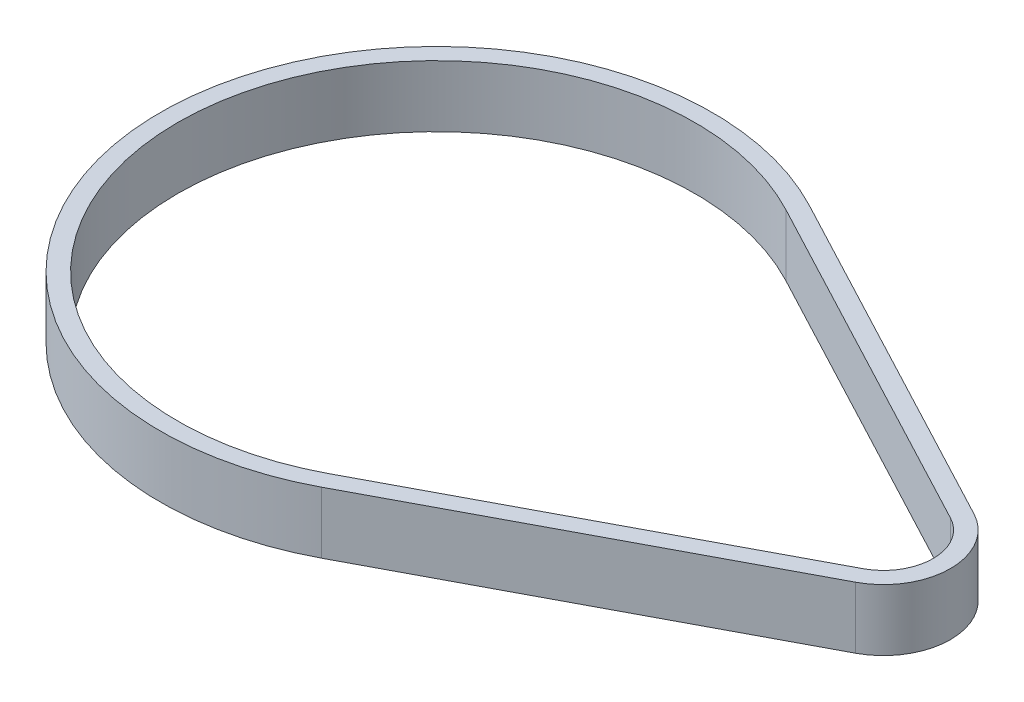
ISO-10303-21;
HEADER;
FILE_DESCRIPTION(('STEP AP214'),'2;1');
FILE_NAME('part.step','',(''),(''),'','','');
FILE_SCHEMA(('AUTOMOTIVE_DESIGN { 1 0 10303 214 1 1 1 1 }'));
ENDSEC;
DATA;
#1=APPLICATION_CONTEXT('core data for automotive mechanical design processes');
#2=APPLICATION_PROTOCOL_DEFINITION('international standard','automotive_design',2000,#1);
#3=PRODUCT_CONTEXT('',#1,'mechanical');
#4=PRODUCT('Part','Part','',(#3));
#5=PRODUCT_RELATED_PRODUCT_CATEGORY('part','',(#4));
#6=PRODUCT_DEFINITION_FORMATION('','',#4);
#7=PRODUCT_DEFINITION_CONTEXT('part definition',#1,'design');
#8=PRODUCT_DEFINITION('design','',#6,#7);
#9=PRODUCT_DEFINITION_SHAPE('','',#8);
#10=(LENGTH_UNIT() NAMED_UNIT(*) SI_UNIT(.MILLI.,.METRE.));
#11=(NAMED_UNIT(*) PLANE_ANGLE_UNIT() SI_UNIT($,.RADIAN.));
#12=(NAMED_UNIT(*) SI_UNIT($,.STERADIAN.) SOLID_ANGLE_UNIT());
#13=UNCERTAINTY_MEASURE_WITH_UNIT(LENGTH_MEASURE(1.E-05),#10,'distance_accuracy_value','');
#14=(GEOMETRIC_REPRESENTATION_CONTEXT(3) GLOBAL_UNCERTAINTY_ASSIGNED_CONTEXT((#13)) GLOBAL_UNIT_ASSIGNED_CONTEXT((#10,
#11,#12)) REPRESENTATION_CONTEXT('',''));
#15=CARTESIAN_POINT('',(0.,0.,0.));
#16=DIRECTION('',(0.,0.,1.));
#17=DIRECTION('',(1.,0.,0.));
#18=AXIS2_PLACEMENT_3D('',#15,#16,#17);
#19=CARTESIAN_POINT('',(0.,9.,0.));
#20=DIRECTION('',(0.,1.,0.));
#21=DIRECTION('',(0.,0.,1.));
#22=AXIS2_PLACEMENT_3D('',#19,#20,#21);
#23=PLANE('',#22);
#24=CARTESIAN_POINT('',(0.,9.,0.));
#25=DIRECTION('',(0.,1.,0.));
#26=DIRECTION('',(0.,0.,1.));
#27=AXIS2_PLACEMENT_3D('',#24,#25,#26);
#28=CIRCLE('',#27,40.365);
#29=CARTESIAN_POINT('',(18.8695034783273,9.,-35.682980025236));
#30=VERTEX_POINT('',#29);
#31=CARTESIAN_POINT('',(18.8695034783273,9.,35.682980025236));
#32=VERTEX_POINT('',#31);
#33=EDGE_CURVE('E136',#30,#32,#28,.T.);
#34=ORIENTED_EDGE('',*,*,#33,.T.);
#35=DIRECTION('',(0.884007928285297,0.,-0.467471905817598));
#36=VECTOR('',#35,1.);
#37=CARTESIAN_POINT('',(69.9815499579543,9.,8.65443761791306));
#38=LINE('',#37,#36);
#39=CARTESIAN_POINT('',(69.9815499579543,9.,8.65443761791306));
#40=VERTEX_POINT('',#39);
#41=EDGE_CURVE('E139',#32,#40,#38,.T.);
#42=ORIENTED_EDGE('',*,*,#41,.T.);
#43=CARTESIAN_POINT('',(65.405,9.,0.));
#44=DIRECTION('',(0.,1.,0.));
#45=DIRECTION('',(0.,0.,1.));
#46=AXIS2_PLACEMENT_3D('',#43,#44,#45);
#47=CIRCLE('',#46,9.79);
#48=CARTESIAN_POINT('',(69.9815499579543,9.,-8.65443761791306));
#49=VERTEX_POINT('',#48);
#50=EDGE_CURVE('E142',#40,#49,#47,.T.);
#51=ORIENTED_EDGE('',*,*,#50,.T.);
#52=DIRECTION('',(-0.884007928285297,0.,-0.467471905817598));
#53=VECTOR('',#52,1.);
#54=CARTESIAN_POINT('',(18.8695034783273,9.,-35.682980025236));
#55=LINE('',#54,#53);
#56=EDGE_CURVE('E144',#49,#30,#55,.T.);
#57=ORIENTED_EDGE('',*,*,#56,.T.);
#58=EDGE_LOOP('',(#34,#42,#51,#57));
#59=FACE_BOUND('',#58,.T.);
#60=DIRECTION('',(0.884007928285297,0.,-0.467471905817598));
#61=VECTOR('',#60,1.);
#62=CARTESIAN_POINT('',(68.7941713171776,9.,6.40905748006841));
#63=LINE('',#62,#61);
#64=CARTESIAN_POINT('',(17.6821248375506,9.,33.4375998873914));
#65=VERTEX_POINT('',#64);
#66=CARTESIAN_POINT('',(68.7941713171776,9.,6.40905748006841));
#67=VERTEX_POINT('',#66);
#68=EDGE_CURVE('E108',#65,#67,#63,.T.);
#69=ORIENTED_EDGE('',*,*,#68,.F.);
#70=CARTESIAN_POINT('',(0.,9.,0.));
#71=DIRECTION('',(0.,1.,0.));
#72=DIRECTION('',(0.,0.,1.));
#73=AXIS2_PLACEMENT_3D('',#70,#71,#72);
#74=CIRCLE('',#73,37.825);
#75=CARTESIAN_POINT('',(17.6821248375506,9.,-33.4375998873914));
#76=VERTEX_POINT('',#75);
#77=EDGE_CURVE('E100',#76,#65,#74,.T.);
#78=ORIENTED_EDGE('',*,*,#77,.F.);
#79=DIRECTION('',(-0.884007928285297,0.,-0.467471905817598));
#80=VECTOR('',#79,1.);
#81=CARTESIAN_POINT('',(17.6821248375506,9.,-33.4375998873914));
#82=LINE('',#81,#80);
#83=CARTESIAN_POINT('',(68.7941713171776,9.,-6.4090574800684));
#84=VERTEX_POINT('',#83);
#85=EDGE_CURVE('E122',#84,#76,#82,.T.);
#86=ORIENTED_EDGE('',*,*,#85,.F.);
#87=CARTESIAN_POINT('',(65.405,9.,0.));
#88=DIRECTION('',(0.,1.,0.));
#89=DIRECTION('',(0.,0.,1.));
#90=AXIS2_PLACEMENT_3D('',#87,#88,#89);
#91=CIRCLE('',#90,7.25);
#92=EDGE_CURVE('E120',#67,#84,#91,.T.);
#93=ORIENTED_EDGE('',*,*,#92,.F.);
#94=EDGE_LOOP('',(#69,#78,#86,#93));
#95=FACE_BOUND('',#94,.T.);
#96=ADVANCED_FACE('F35',(#59,#95),#23,.T.);
#97=CARTESIAN_POINT('',(0.,0.,0.));
#98=DIRECTION('',(0.,1.,0.));
#99=DIRECTION('',(0.,0.,1.));
#100=AXIS2_PLACEMENT_3D('',#97,#98,#99);
#101=PLANE('',#100);
#102=CARTESIAN_POINT('',(0.,0.,0.));
#103=DIRECTION('',(0.,1.,0.));
#104=DIRECTION('',(0.,0.,1.));
#105=AXIS2_PLACEMENT_3D('',#102,#103,#104);
#106=CIRCLE('',#105,40.365);
#107=CARTESIAN_POINT('',(18.8695034783273,0.,-35.682980025236));
#108=VERTEX_POINT('',#107);
#109=CARTESIAN_POINT('',(18.8695034783273,0.,35.682980025236));
#110=VERTEX_POINT('',#109);
#111=EDGE_CURVE('E116',#108,#110,#106,.T.);
#112=ORIENTED_EDGE('',*,*,#111,.F.);
#113=DIRECTION('',(-0.884007928285297,0.,-0.467471905817598));
#114=VECTOR('',#113,1.);
#115=CARTESIAN_POINT('',(18.8695034783273,0.,-35.682980025236));
#116=LINE('',#115,#114);
#117=CARTESIAN_POINT('',(69.9815499579543,0.,-8.65443761791306));
#118=VERTEX_POINT('',#117);
#119=EDGE_CURVE('E140',#118,#108,#116,.T.);
#120=ORIENTED_EDGE('',*,*,#119,.F.);
#121=CARTESIAN_POINT('',(65.405,0.,0.));
#122=DIRECTION('',(0.,1.,0.));
#123=DIRECTION('',(0.,0.,1.));
#124=AXIS2_PLACEMENT_3D('',#121,#122,#123);
#125=CIRCLE('',#124,9.79);
#126=CARTESIAN_POINT('',(69.9815499579543,0.,8.65443761791306));
#127=VERTEX_POINT('',#126);
#128=EDGE_CURVE('E151',#127,#118,#125,.T.);
#129=ORIENTED_EDGE('',*,*,#128,.F.);
#130=DIRECTION('',(0.884007928285297,0.,-0.467471905817598));
#131=VECTOR('',#130,1.);
#132=CARTESIAN_POINT('',(69.9815499579543,0.,8.65443761791306));
#133=LINE('',#132,#131);
#134=EDGE_CURVE('E149',#110,#127,#133,.T.);
#135=ORIENTED_EDGE('',*,*,#134,.F.);
#136=EDGE_LOOP('',(#112,#120,#129,#135));
#137=FACE_BOUND('',#136,.T.);
#138=CARTESIAN_POINT('',(0.,0.,0.));
#139=DIRECTION('',(0.,1.,0.));
#140=DIRECTION('',(0.,0.,1.));
#141=AXIS2_PLACEMENT_3D('',#138,#139,#140);
#142=CIRCLE('',#141,37.825);
#143=CARTESIAN_POINT('',(17.6821248375506,0.,-33.4375998873914));
#144=VERTEX_POINT('',#143);
#145=CARTESIAN_POINT('',(17.6821248375506,0.,33.4375998873914));
#146=VERTEX_POINT('',#145);
#147=EDGE_CURVE('E58',#144,#146,#142,.T.);
#148=ORIENTED_EDGE('',*,*,#147,.T.);
#149=DIRECTION('',(0.884007928285297,0.,-0.467471905817598));
#150=VECTOR('',#149,1.);
#151=CARTESIAN_POINT('',(68.7941713171776,0.,6.40905748006841));
#152=LINE('',#151,#150);
#153=CARTESIAN_POINT('',(68.7941713171776,0.,6.40905748006841));
#154=VERTEX_POINT('',#153);
#155=EDGE_CURVE('E115',#146,#154,#152,.T.);
#156=ORIENTED_EDGE('',*,*,#155,.T.);
#157=CARTESIAN_POINT('',(65.405,0.,0.));
#158=DIRECTION('',(0.,1.,0.));
#159=DIRECTION('',(0.,0.,1.));
#160=AXIS2_PLACEMENT_3D('',#157,#158,#159);
#161=CIRCLE('',#160,7.25);
#162=CARTESIAN_POINT('',(68.7941713171776,0.,-6.4090574800684));
#163=VERTEX_POINT('',#162);
#164=EDGE_CURVE('E128',#154,#163,#161,.T.);
#165=ORIENTED_EDGE('',*,*,#164,.T.);
#166=DIRECTION('',(-0.884007928285297,0.,-0.467471905817598));
#167=VECTOR('',#166,1.);
#168=CARTESIAN_POINT('',(17.6821248375506,0.,-33.4375998873914));
#169=LINE('',#168,#167);
#170=EDGE_CURVE('E109',#163,#144,#169,.T.);
#171=ORIENTED_EDGE('',*,*,#170,.T.);
#172=EDGE_LOOP('',(#148,#156,#165,#171));
#173=FACE_BOUND('',#172,.T.);
#174=ADVANCED_FACE('F169',(#137,#173),#101,.F.);
#175=CARTESIAN_POINT('',(0.,9.,0.));
#176=DIRECTION('',(0.,-1.,0.));
#177=DIRECTION('',(0.,0.,-1.));
#178=AXIS2_PLACEMENT_3D('',#175,#176,#177);
#179=CYLINDRICAL_SURFACE('',#178,40.365);
#180=ORIENTED_EDGE('',*,*,#111,.T.);
#181=DIRECTION('',(0.,-1.,0.));
#182=VECTOR('',#181,1.);
#183=CARTESIAN_POINT('',(18.8695034783273,9.,35.682980025236));
#184=LINE('',#183,#182);
#185=EDGE_CURVE('E11',#32,#110,#184,.T.);
#186=ORIENTED_EDGE('',*,*,#185,.F.);
#187=ORIENTED_EDGE('',*,*,#33,.F.);
#188=DIRECTION('',(0.,-1.,0.));
#189=VECTOR('',#188,1.);
#190=CARTESIAN_POINT('',(18.8695034783273,9.,-35.682980025236));
#191=LINE('',#190,#189);
#192=EDGE_CURVE('E146',#30,#108,#191,.T.);
#193=ORIENTED_EDGE('',*,*,#192,.T.);
#194=EDGE_LOOP('',(#180,#186,#187,#193));
#195=FACE_BOUND('',#194,.T.);
#196=ADVANCED_FACE('F37',(#195),#179,.T.);
#197=CARTESIAN_POINT('',(69.9815499579543,9.,8.65443761791306));
#198=DIRECTION('',(-0.467471905817598,0.,-0.884007928285297));
#199=DIRECTION('',(-0.884007928285297,0.,0.467471905817598));
#200=AXIS2_PLACEMENT_3D('',#197,#198,#199);
#201=PLANE('',#200);
#202=ORIENTED_EDGE('',*,*,#134,.T.);
#203=DIRECTION('',(0.,-1.,0.));
#204=VECTOR('',#203,1.);
#205=CARTESIAN_POINT('',(69.9815499579543,9.,8.65443761791306));
#206=LINE('',#205,#204);
#207=EDGE_CURVE('E43',#40,#127,#206,.T.);
#208=ORIENTED_EDGE('',*,*,#207,.F.);
#209=ORIENTED_EDGE('',*,*,#41,.F.);
#210=ORIENTED_EDGE('',*,*,#185,.T.);
#211=EDGE_LOOP('',(#202,#208,#209,#210));
#212=FACE_BOUND('',#211,.T.);
#213=ADVANCED_FACE('F179',(#212),#201,.F.);
#214=CARTESIAN_POINT('',(65.405,9.,0.));
#215=DIRECTION('',(0.,-1.,0.));
#216=DIRECTION('',(0.,0.,-1.));
#217=AXIS2_PLACEMENT_3D('',#214,#215,#216);
#218=CYLINDRICAL_SURFACE('',#217,9.79);
#219=ORIENTED_EDGE('',*,*,#128,.T.);
#220=DIRECTION('',(0.,-1.,0.));
#221=VECTOR('',#220,1.);
#222=CARTESIAN_POINT('',(69.9815499579543,9.,-8.65443761791306));
#223=LINE('',#222,#221);
#224=EDGE_CURVE('E156',#49,#118,#223,.T.);
#225=ORIENTED_EDGE('',*,*,#224,.F.);
#226=ORIENTED_EDGE('',*,*,#50,.F.);
#227=ORIENTED_EDGE('',*,*,#207,.T.);
#228=EDGE_LOOP('',(#219,#225,#226,#227));
#229=FACE_BOUND('',#228,.T.);
#230=ADVANCED_FACE('F163',(#229),#218,.T.);
#231=CARTESIAN_POINT('',(18.8695034783273,9.,-35.682980025236));
#232=DIRECTION('',(-0.467471905817598,0.,0.884007928285297));
#233=DIRECTION('',(0.884007928285297,0.,0.467471905817598));
#234=AXIS2_PLACEMENT_3D('',#231,#232,#233);
#235=PLANE('',#234);
#236=ORIENTED_EDGE('',*,*,#119,.T.);
#237=ORIENTED_EDGE('',*,*,#192,.F.);
#238=ORIENTED_EDGE('',*,*,#56,.F.);
#239=ORIENTED_EDGE('',*,*,#224,.T.);
#240=EDGE_LOOP('',(#236,#237,#238,#239));
#241=FACE_BOUND('',#240,.T.);
#242=ADVANCED_FACE('F173',(#241),#235,.F.);
#243=CARTESIAN_POINT('',(0.,9.,0.));
#244=DIRECTION('',(0.,-1.,0.));
#245=DIRECTION('',(0.,0.,-1.));
#246=AXIS2_PLACEMENT_3D('',#243,#244,#245);
#247=CYLINDRICAL_SURFACE('',#246,37.825);
#248=ORIENTED_EDGE('',*,*,#147,.F.);
#249=DIRECTION('',(0.,-1.,0.));
#250=VECTOR('',#249,1.);
#251=CARTESIAN_POINT('',(17.6821248375506,9.,-33.4375998873914));
#252=LINE('',#251,#250);
#253=EDGE_CURVE('E104',#76,#144,#252,.T.);
#254=ORIENTED_EDGE('',*,*,#253,.F.);
#255=ORIENTED_EDGE('',*,*,#77,.T.);
#256=DIRECTION('',(0.,-1.,0.));
#257=VECTOR('',#256,1.);
#258=CARTESIAN_POINT('',(17.6821248375506,9.,33.4375998873914));
#259=LINE('',#258,#257);
#260=EDGE_CURVE('E103',#65,#146,#259,.T.);
#261=ORIENTED_EDGE('',*,*,#260,.T.);
#262=EDGE_LOOP('',(#248,#254,#255,#261));
#263=FACE_BOUND('',#262,.T.);
#264=ADVANCED_FACE('F102',(#263),#247,.F.);
#265=CARTESIAN_POINT('',(68.7941713171776,9.,6.40905748006841));
#266=DIRECTION('',(-0.467471905817598,0.,-0.884007928285297));
#267=DIRECTION('',(-0.884007928285297,0.,0.467471905817598));
#268=AXIS2_PLACEMENT_3D('',#265,#266,#267);
#269=PLANE('',#268);
#270=ORIENTED_EDGE('',*,*,#155,.F.);
#271=ORIENTED_EDGE('',*,*,#260,.F.);
#272=ORIENTED_EDGE('',*,*,#68,.T.);
#273=DIRECTION('',(0.,-1.,0.));
#274=VECTOR('',#273,1.);
#275=CARTESIAN_POINT('',(68.7941713171776,9.,6.40905748006841));
#276=LINE('',#275,#274);
#277=EDGE_CURVE('E117',#67,#154,#276,.T.);
#278=ORIENTED_EDGE('',*,*,#277,.T.);
#279=EDGE_LOOP('',(#270,#271,#272,#278));
#280=FACE_BOUND('',#279,.T.);
#281=ADVANCED_FACE('F112',(#280),#269,.T.);
#282=CARTESIAN_POINT('',(65.405,9.,0.));
#283=DIRECTION('',(0.,-1.,0.));
#284=DIRECTION('',(0.,0.,-1.));
#285=AXIS2_PLACEMENT_3D('',#282,#283,#284);
#286=CYLINDRICAL_SURFACE('',#285,7.25);
#287=ORIENTED_EDGE('',*,*,#164,.F.);
#288=ORIENTED_EDGE('',*,*,#277,.F.);
#289=ORIENTED_EDGE('',*,*,#92,.T.);
#290=DIRECTION('',(0.,-1.,0.));
#291=VECTOR('',#290,1.);
#292=CARTESIAN_POINT('',(68.7941713171776,9.,-6.4090574800684));
#293=LINE('',#292,#291);
#294=EDGE_CURVE('E50',#84,#163,#293,.T.);
#295=ORIENTED_EDGE('',*,*,#294,.T.);
#296=EDGE_LOOP('',(#287,#288,#289,#295));
#297=FACE_BOUND('',#296,.T.);
#298=ADVANCED_FACE('F202',(#297),#286,.F.);
#299=CARTESIAN_POINT('',(17.6821248375506,9.,-33.4375998873914));
#300=DIRECTION('',(-0.467471905817598,0.,0.884007928285297));
#301=DIRECTION('',(0.884007928285297,0.,0.467471905817598));
#302=AXIS2_PLACEMENT_3D('',#299,#300,#301);
#303=PLANE('',#302);
#304=ORIENTED_EDGE('',*,*,#170,.F.);
#305=ORIENTED_EDGE('',*,*,#294,.F.);
#306=ORIENTED_EDGE('',*,*,#85,.T.);
#307=ORIENTED_EDGE('',*,*,#253,.T.);
#308=EDGE_LOOP('',(#304,#305,#306,#307));
#309=FACE_BOUND('',#308,.T.);
#310=ADVANCED_FACE('F206',(#309),#303,.T.);
#311=CLOSED_SHELL('',(#96,#174,#196,#213,#230,#242,#264,#281,#298,#310));
#312=MANIFOLD_SOLID_BREP('B2',#311);
#313=ADVANCED_BREP_SHAPE_REPRESENTATION('',(#18,#312),#14);
#314=SHAPE_DEFINITION_REPRESENTATION(#9,#313);
ENDSEC;
END-ISO-10303-21;
